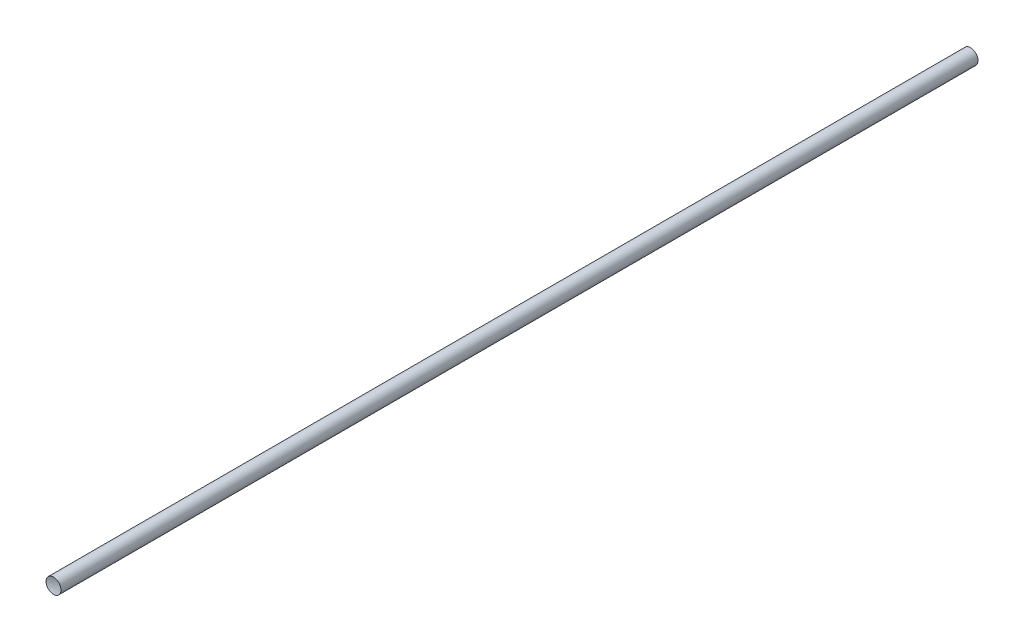
ISO-10303-21;
HEADER;
FILE_DESCRIPTION(('STEP AP214'),'2;1');
FILE_NAME('part.step','',(''),(''),'','','');
FILE_SCHEMA(('AUTOMOTIVE_DESIGN { 1 0 10303 214 1 1 1 1 }'));
ENDSEC;
DATA;
#1=APPLICATION_CONTEXT('core data for automotive mechanical design processes');
#2=APPLICATION_PROTOCOL_DEFINITION('international standard','automotive_design',2000,#1);
#3=PRODUCT_CONTEXT('',#1,'mechanical');
#4=PRODUCT('Part','Part','',(#3));
#5=PRODUCT_RELATED_PRODUCT_CATEGORY('part','',(#4));
#6=PRODUCT_DEFINITION_FORMATION('','',#4);
#7=PRODUCT_DEFINITION_CONTEXT('part definition',#1,'design');
#8=PRODUCT_DEFINITION('design','',#6,#7);
#9=PRODUCT_DEFINITION_SHAPE('','',#8);
#10=(LENGTH_UNIT() NAMED_UNIT(*) SI_UNIT(.MILLI.,.METRE.));
#11=(NAMED_UNIT(*) PLANE_ANGLE_UNIT() SI_UNIT($,.RADIAN.));
#12=(NAMED_UNIT(*) SI_UNIT($,.STERADIAN.) SOLID_ANGLE_UNIT());
#13=UNCERTAINTY_MEASURE_WITH_UNIT(LENGTH_MEASURE(1.E-05),#10,'distance_accuracy_value','');
#14=(GEOMETRIC_REPRESENTATION_CONTEXT(3) GLOBAL_UNCERTAINTY_ASSIGNED_CONTEXT((#13)) GLOBAL_UNIT_ASSIGNED_CONTEXT((#10,
#11,#12)) REPRESENTATION_CONTEXT('',''));
#15=CARTESIAN_POINT('',(0.,0.,0.));
#16=DIRECTION('',(0.,0.,1.));
#17=DIRECTION('',(1.,0.,0.));
#18=AXIS2_PLACEMENT_3D('',#15,#16,#17);
#19=CARTESIAN_POINT('',(0.,0.,128.4));
#20=DIRECTION('',(0.,0.,-1.));
#21=DIRECTION('',(-1.,0.,0.));
#22=AXIS2_PLACEMENT_3D('',#19,#20,#21);
#23=CYLINDRICAL_SURFACE('',#22,2.);
#24=CARTESIAN_POINT('',(0.,0.,-122.373184920706));
#25=DIRECTION('',(0.,0.,-0.999999999999999));
#26=DIRECTION('',(-1.,0.,0.));
#27=AXIS2_PLACEMENT_3D('',#24,#25,#26);
#28=CIRCLE('',#27,2.);
#29=CARTESIAN_POINT('',(-2.,0.,-122.373184920706));
#30=VERTEX_POINT('',#29);
#31=EDGE_CURVE('E10',#30,#30,#28,.T.);
#32=CARTESIAN_POINT('',(0.,0.,122.373184920706));
#33=DIRECTION('',(0.,0.,0.999999999999999));
#34=DIRECTION('',(1.,0.,0.));
#35=AXIS2_PLACEMENT_3D('',#32,#33,#34);
#36=CIRCLE('',#35,2.);
#37=CARTESIAN_POINT('',(-2.,0.,122.373184920706));
#38=VERTEX_POINT('',#37);
#39=EDGE_CURVE('E36',#38,#38,#36,.T.);
#40=CARTESIAN_POINT('',(-2.,0.,-122.373184920706));
#41=CARTESIAN_POINT('',(-2.,0.,-119.823743568192));
#42=CARTESIAN_POINT('',(-2.,0.,-117.274302215677));
#43=CARTESIAN_POINT('',(-2.,0.,-112.175419510648));
#44=CARTESIAN_POINT('',(-2.,0.,-109.625978158133));
#45=CARTESIAN_POINT('',(-2.,0.,-104.527095453103));
#46=CARTESIAN_POINT('',(-2.,0.,-101.977654100589));
#47=CARTESIAN_POINT('',(-2.,0.,-96.8787713955592));
#48=CARTESIAN_POINT('',(-2.,0.,-94.3293300430445));
#49=CARTESIAN_POINT('',(-2.,0.,-89.2304473380151));
#50=CARTESIAN_POINT('',(-2.,0.,-86.6810059855004));
#51=CARTESIAN_POINT('',(-2.,0.,-81.5821232804709));
#52=CARTESIAN_POINT('',(-2.,0.,-79.0326819279562));
#53=CARTESIAN_POINT('',(-2.,0.,-73.9337992229268));
#54=CARTESIAN_POINT('',(-2.,0.,-71.3843578704121));
#55=CARTESIAN_POINT('',(-2.,0.,-66.2854751653826));
#56=CARTESIAN_POINT('',(-2.,0.,-63.7360338128679));
#57=CARTESIAN_POINT('',(-2.,0.,-58.6371511078385));
#58=CARTESIAN_POINT('',(-2.,0.,-56.0877097553238));
#59=CARTESIAN_POINT('',(-2.,0.,-50.9888270502943));
#60=CARTESIAN_POINT('',(-2.,0.,-48.4393856977796));
#61=CARTESIAN_POINT('',(-2.,0.,-43.3405029927502));
#62=CARTESIAN_POINT('',(-2.,0.,-40.7910616402355));
#63=CARTESIAN_POINT('',(-2.,0.,-35.692178935206));
#64=CARTESIAN_POINT('',(-2.,0.,-33.1427375826913));
#65=CARTESIAN_POINT('',(-2.,0.,-28.0438548776619));
#66=CARTESIAN_POINT('',(-2.,0.,-25.4944135251471));
#67=CARTESIAN_POINT('',(-2.,0.,-20.3955308201177));
#68=CARTESIAN_POINT('',(-2.,0.,-17.846089467603));
#69=CARTESIAN_POINT('',(-2.,0.,-12.7472067625736));
#70=CARTESIAN_POINT('',(-2.,0.,-10.1977654100588));
#71=CARTESIAN_POINT('',(-2.,0.,-5.0988827050294));
#72=CARTESIAN_POINT('',(-2.,0.,-2.54944135251469));
#73=CARTESIAN_POINT('',(-2.,0.,2.54944135251474));
#74=CARTESIAN_POINT('',(-2.,0.,5.09888270502946));
#75=CARTESIAN_POINT('',(-2.,0.,10.1977654100589));
#76=CARTESIAN_POINT('',(-2.,0.,12.7472067625736));
#77=CARTESIAN_POINT('',(-2.,0.,17.8460894676031));
#78=CARTESIAN_POINT('',(-2.,0.,20.3955308201178));
#79=CARTESIAN_POINT('',(-2.,0.,25.4944135251472));
#80=CARTESIAN_POINT('',(-2.,0.,28.0438548776619));
#81=CARTESIAN_POINT('',(-2.,0.,33.1427375826914));
#82=CARTESIAN_POINT('',(-2.,0.,35.6921789352061));
#83=CARTESIAN_POINT('',(-2.,0.,40.7910616402355));
#84=CARTESIAN_POINT('',(-2.,0.,43.3405029927502));
#85=CARTESIAN_POINT('',(-2.,0.,48.4393856977797));
#86=CARTESIAN_POINT('',(-2.,0.,50.9888270502944));
#87=CARTESIAN_POINT('',(-2.,0.,56.0877097553238));
#88=CARTESIAN_POINT('',(-2.,0.,58.6371511078385));
#89=CARTESIAN_POINT('',(-2.,0.,63.736033812868));
#90=CARTESIAN_POINT('',(-2.,0.,66.2854751653827));
#91=CARTESIAN_POINT('',(-2.,0.,71.3843578704121));
#92=CARTESIAN_POINT('',(-2.,0.,73.9337992229269));
#93=CARTESIAN_POINT('',(-2.,0.,79.0326819279563));
#94=CARTESIAN_POINT('',(-2.,0.,81.582123280471));
#95=CARTESIAN_POINT('',(-2.,0.,86.6810059855004));
#96=CARTESIAN_POINT('',(-2.,0.,89.2304473380152));
#97=CARTESIAN_POINT('',(-2.,0.,94.3293300430446));
#98=CARTESIAN_POINT('',(-2.,0.,96.8787713955593));
#99=CARTESIAN_POINT('',(-2.,0.,101.977654100589));
#100=CARTESIAN_POINT('',(-2.,0.,104.527095453103));
#101=CARTESIAN_POINT('',(-2.,0.,109.625978158133));
#102=CARTESIAN_POINT('',(-2.,0.,112.175419510648));
#103=CARTESIAN_POINT('',(-2.,0.,117.274302215677));
#104=CARTESIAN_POINT('',(-2.,0.,119.823743568192));
#105=CARTESIAN_POINT('',(-2.,0.,122.373184920706));
#106=B_SPLINE_CURVE_WITH_KNOTS('',3,(#40,#41,#42,#43,#44,#45,#46,#47,#48,#49,#50,#51,#52,#53,
#54,#55,#56,#57,#58,#59,#60,#61,#62,#63,#64,#65,#66,#67,#68,#69,#70,#71,#72,#73,#74,#75,#76,#77,
#78,#79,#80,#81,#82,#83,#84,#85,#86,#87,#88,#89,#90,#91,#92,#93,#94,#95,#96,#97,#98,#99,#100,
#101,#102,#103,#104,#105),.UNSPECIFIED.,.F.,.F.,(4,2,2,2,2,2,2,2,2,2,2,2,2,2,2,2,2,2,2,2,2,2,2,
2,2,2,2,2,2,2,2,2,4),(0.,7.64832405754415,15.2966481150883,22.9449721726325,30.5932962301766,
38.2416202877208,45.8899443452649,53.5382684028091,61.1865924603532,68.8349165178974,
76.4832405754415,84.1315646329857,91.7798886905298,99.428212748074,107.076536805618,
114.724860863162,122.373184920706,130.021508978251,137.669833035795,145.318157093339,
152.966481150883,160.614805208427,168.263129265971,175.911453323516,183.55977738106,
191.208101438604,198.856425496148,206.504749553692,214.153073611236,221.80139766878,
229.449721726325,237.098045783869,244.746369841413),.UNSPECIFIED.);
#107=EDGE_CURVE('BSEAM33',#30,#38,#106,.T.);
#108=ORIENTED_EDGE('',*,*,#31,.F.);
#109=ORIENTED_EDGE('',*,*,#39,.F.);
#110=ORIENTED_EDGE('',*,*,#107,.T.);
#111=ORIENTED_EDGE('',*,*,#107,.F.);
#112=EDGE_LOOP('',(#108,#110,#109,#111));
#113=FACE_BOUND('',#112,.T.);
#114=ADVANCED_FACE('F33',(#113),#23,.T.);
#115=CARTESIAN_POINT('',(0.,0.,-128.4));
#116=DIRECTION('',(1.,0.,0.));
#117=DIRECTION('',(0.,0.,1.));
#118=AXIS2_PLACEMENT_3D('',#115,#116,#117);
#119=SPHERICAL_SURFACE('',#118,6.35);
#120=CARTESIAN_POINT('',(0.,0.,-128.4));
#121=DIRECTION('',(0.,0.,-1.));
#122=DIRECTION('',(-1.,0.,0.));
#123=AXIS2_PLACEMENT_3D('',#120,#121,#122);
#124=SPHERICAL_SURFACE('',#123,6.35);
#125=ORIENTED_EDGE('',*,*,#31,.T.);
#126=EDGE_LOOP('',(#125));
#127=FACE_BOUND('',#126,.T.);
#128=ADVANCED_FACE('F48',(#127),#124,.F.);
#129=CARTESIAN_POINT('',(0.,0.,128.4));
#130=DIRECTION('',(1.,0.,0.));
#131=DIRECTION('',(0.,0.,-1.));
#132=AXIS2_PLACEMENT_3D('',#129,#130,#131);
#133=SPHERICAL_SURFACE('',#132,6.35);
#134=CARTESIAN_POINT('',(0.,0.,128.4));
#135=DIRECTION('',(0.,0.,1.));
#136=DIRECTION('',(1.,0.,0.));
#137=AXIS2_PLACEMENT_3D('',#134,#135,#136);
#138=SPHERICAL_SURFACE('',#137,6.35);
#139=ORIENTED_EDGE('',*,*,#39,.T.);
#140=EDGE_LOOP('',(#139));
#141=FACE_BOUND('',#140,.T.);
#142=ADVANCED_FACE('F45',(#141),#138,.F.);
#143=CLOSED_SHELL('',(#114,#128,#142));
#144=MANIFOLD_SOLID_BREP('B2',#143);
#145=ADVANCED_BREP_SHAPE_REPRESENTATION('',(#18,#144),#14);
#146=SHAPE_DEFINITION_REPRESENTATION(#9,#145);
ENDSEC;
END-ISO-10303-21;
